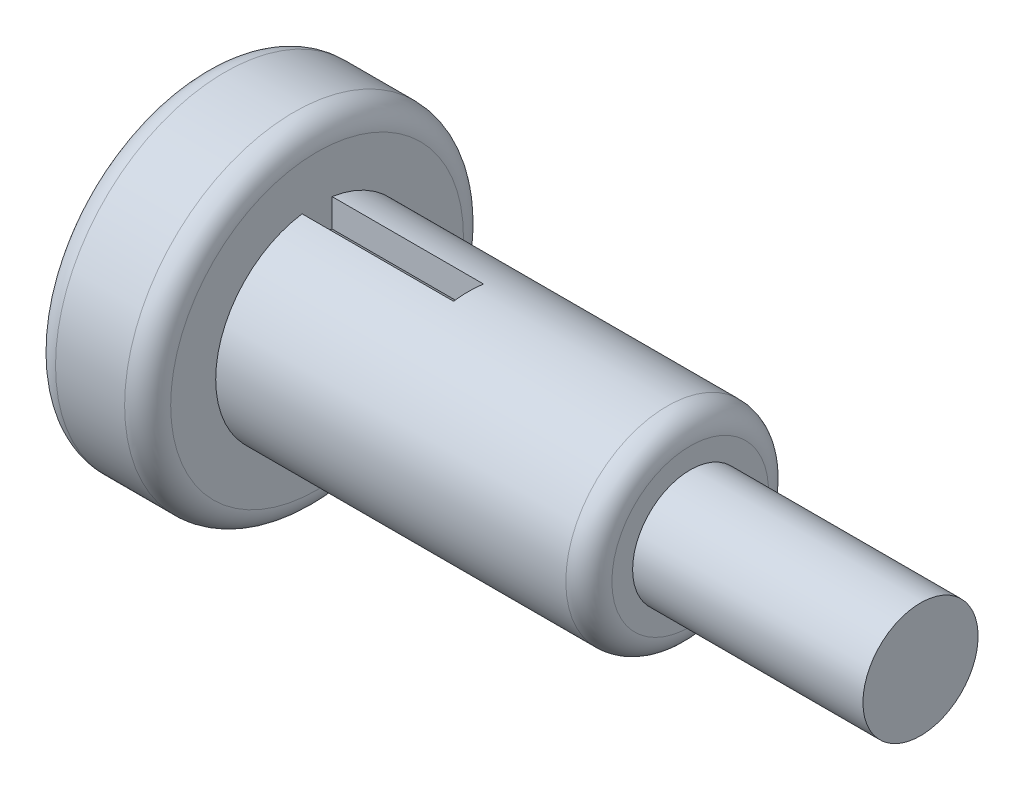
ISO-10303-21;
HEADER;
FILE_DESCRIPTION(('STEP AP214'),'2;1');
FILE_NAME('part.step','',(''),(''),'','','');
FILE_SCHEMA(('AUTOMOTIVE_DESIGN { 1 0 10303 214 1 1 1 1 }'));
ENDSEC;
DATA;
#1=APPLICATION_CONTEXT('core data for automotive mechanical design processes');
#2=APPLICATION_PROTOCOL_DEFINITION('international standard','automotive_design',2000,#1);
#3=PRODUCT_CONTEXT('',#1,'mechanical');
#4=PRODUCT('Part','Part','',(#3));
#5=PRODUCT_RELATED_PRODUCT_CATEGORY('part','',(#4));
#6=PRODUCT_DEFINITION_FORMATION('','',#4);
#7=PRODUCT_DEFINITION_CONTEXT('part definition',#1,'design');
#8=PRODUCT_DEFINITION('design','',#6,#7);
#9=PRODUCT_DEFINITION_SHAPE('','',#8);
#10=(LENGTH_UNIT() NAMED_UNIT(*) SI_UNIT(.MILLI.,.METRE.));
#11=(NAMED_UNIT(*) PLANE_ANGLE_UNIT() SI_UNIT($,.RADIAN.));
#12=(NAMED_UNIT(*) SI_UNIT($,.STERADIAN.) SOLID_ANGLE_UNIT());
#13=UNCERTAINTY_MEASURE_WITH_UNIT(LENGTH_MEASURE(1.E-05),#10,'distance_accuracy_value','');
#14=(GEOMETRIC_REPRESENTATION_CONTEXT(3) GLOBAL_UNCERTAINTY_ASSIGNED_CONTEXT((#13)) GLOBAL_UNIT_ASSIGNED_CONTEXT((#10,
#11,#12)) REPRESENTATION_CONTEXT('',''));
#15=CARTESIAN_POINT('',(0.,0.,0.));
#16=DIRECTION('',(0.,0.,1.));
#17=DIRECTION('',(1.,0.,0.));
#18=AXIS2_PLACEMENT_3D('',#15,#16,#17);
#19=CARTESIAN_POINT('',(-25.6768802228412,0.,0.));
#20=DIRECTION('',(-1.,0.,0.));
#21=DIRECTION('',(0.,0.,1.));
#22=AXIS2_PLACEMENT_3D('',#19,#20,#21);
#23=CYLINDRICAL_SURFACE('',#22,22.);
#24=CARTESIAN_POINT('',(-10.6768802228413,0.,0.));
#25=DIRECTION('',(-1.,0.,0.));
#26=DIRECTION('',(0.,0.,1.));
#27=AXIS2_PLACEMENT_3D('',#24,#25,#26);
#28=CIRCLE('',#27,22.);
#29=CARTESIAN_POINT('',(-10.6768802228413,0.,22.));
#30=VERTEX_POINT('',#29);
#31=EDGE_CURVE('E152',#30,#30,#28,.T.);
#32=ORIENTED_EDGE('',*,*,#31,.T.);
#33=EDGE_LOOP('',(#32));
#34=FACE_BOUND('',#33,.T.);
#35=DIRECTION('',(-1.,0.,0.));
#36=VECTOR('',#35,1.);
#37=CARTESIAN_POINT('',(-25.6768802228412,21.7586189819115,-3.25));
#38=LINE('',#37,#36);
#39=CARTESIAN_POINT('',(-53.8001498066124,21.7586189819115,-3.25));
#40=VERTEX_POINT('',#39);
#41=CARTESIAN_POINT('',(-86.6768802228412,21.7586189819115,-3.25));
#42=VERTEX_POINT('',#41);
#43=EDGE_CURVE('E182',#40,#42,#38,.T.);
#44=ORIENTED_EDGE('',*,*,#43,.F.);
#45=CARTESIAN_POINT('',(-55.4360263892614,0.,0.));
#46=DIRECTION('',(0.997185689275165,-0.074971335220956,0.));
#47=DIRECTION('',(-0.074971335220956,-0.997185689275166,0.));
#48=AXIS2_PLACEMENT_3D('',#45,#46,#47);
#49=ELLIPSE('',#48,22.062089575304,22.);
#50=CARTESIAN_POINT('',(-53.8001498066124,21.7586189819115,3.25));
#51=VERTEX_POINT('',#50);
#52=EDGE_CURVE('E178',#40,#51,#49,.T.);
#53=ORIENTED_EDGE('',*,*,#52,.T.);
#54=DIRECTION('',(-1.,0.,0.));
#55=VECTOR('',#54,1.);
#56=CARTESIAN_POINT('',(-25.6768802228412,21.7586189819115,3.25));
#57=LINE('',#56,#55);
#58=CARTESIAN_POINT('',(-86.6768802228412,21.7586189819115,3.25));
#59=VERTEX_POINT('',#58);
#60=EDGE_CURVE('E186',#51,#59,#57,.T.);
#61=ORIENTED_EDGE('',*,*,#60,.T.);
#62=CARTESIAN_POINT('',(-86.6768802228412,0.,0.));
#63=DIRECTION('',(-1.,0.,0.));
#64=DIRECTION('',(0.,0.,1.));
#65=AXIS2_PLACEMENT_3D('',#62,#63,#64);
#66=CIRCLE('',#65,22.);
#67=CARTESIAN_POINT('',(-86.6768802228412,-21.7586189819115,3.25));
#68=VERTEX_POINT('',#67);
#69=EDGE_CURVE('E123',#68,#59,#66,.T.);
#70=ORIENTED_EDGE('',*,*,#69,.F.);
#71=DIRECTION('',(-1.,0.,0.));
#72=VECTOR('',#71,1.);
#73=CARTESIAN_POINT('',(-25.6768802228412,-21.7586189819115,3.25));
#74=LINE('',#73,#72);
#75=CARTESIAN_POINT('',(-57.0719029719104,-21.7586189819115,3.25));
#76=VERTEX_POINT('',#75);
#77=EDGE_CURVE('E188',#68,#76,#74,.F.);
#78=ORIENTED_EDGE('',*,*,#77,.T.);
#79=CARTESIAN_POINT('',(-57.0719029719104,-21.7586189819115,-3.25));
#80=VERTEX_POINT('',#79);
#81=EDGE_CURVE('E179',#76,#80,#49,.T.);
#82=ORIENTED_EDGE('',*,*,#81,.T.);
#83=DIRECTION('',(-1.,0.,0.));
#84=VECTOR('',#83,1.);
#85=CARTESIAN_POINT('',(-25.6768802228412,-21.7586189819115,-3.25));
#86=LINE('',#85,#84);
#87=CARTESIAN_POINT('',(-86.6768802228412,-21.7586189819115,-3.25));
#88=VERTEX_POINT('',#87);
#89=EDGE_CURVE('E184',#88,#80,#86,.F.);
#90=ORIENTED_EDGE('',*,*,#89,.F.);
#91=EDGE_CURVE('E155',#42,#88,#66,.T.);
#92=ORIENTED_EDGE('',*,*,#91,.F.);
#93=EDGE_LOOP('',(#44,#53,#61,#70,#78,#82,#90,#92));
#94=FACE_BOUND('',#93,.T.);
#95=ADVANCED_FACE('F42',(#34,#94),#23,.T.);
#96=CARTESIAN_POINT('',(-25.6768802228412,0.,0.));
#97=DIRECTION('',(-1.,0.,0.));
#98=DIRECTION('',(0.,0.,1.));
#99=AXIS2_PLACEMENT_3D('',#96,#97,#98);
#100=CYLINDRICAL_SURFACE('',#99,16.);
#101=DIRECTION('',(-1.,0.,0.));
#102=VECTOR('',#101,1.);
#103=CARTESIAN_POINT('',(-25.6768802228412,-15.6664450338933,-3.25));
#104=LINE('',#103,#102);
#105=CARTESIAN_POINT('',(-56.6138755250732,-15.6664450338933,-3.25));
#106=VERTEX_POINT('',#105);
#107=CARTESIAN_POINT('',(-86.6768802228412,-15.6664450338933,-3.25));
#108=VERTEX_POINT('',#107);
#109=EDGE_CURVE('E113',#106,#108,#104,.T.);
#110=ORIENTED_EDGE('',*,*,#109,.F.);
#111=CARTESIAN_POINT('',(-55.4360263892614,0.,0.));
#112=DIRECTION('',(0.997185689275165,-0.074971335220956,0.));
#113=DIRECTION('',(-0.074971335220956,-0.997185689275166,0.));
#114=AXIS2_PLACEMENT_3D('',#111,#112,#113);
#115=ELLIPSE('',#114,16.0451560547666,16.);
#116=CARTESIAN_POINT('',(-56.6138755250732,-15.6664450338933,3.25));
#117=VERTEX_POINT('',#116);
#118=EDGE_CURVE('E132',#106,#117,#115,.F.);
#119=ORIENTED_EDGE('',*,*,#118,.T.);
#120=DIRECTION('',(-1.,0.,0.));
#121=VECTOR('',#120,1.);
#122=CARTESIAN_POINT('',(-25.6768802228412,-15.6664450338933,3.25));
#123=LINE('',#122,#121);
#124=CARTESIAN_POINT('',(-86.6768802228412,-15.6664450338933,3.25));
#125=VERTEX_POINT('',#124);
#126=EDGE_CURVE('E140',#117,#125,#123,.T.);
#127=ORIENTED_EDGE('',*,*,#126,.T.);
#128=CARTESIAN_POINT('',(-86.6768802228412,0.,0.));
#129=DIRECTION('',(-1.,0.,0.));
#130=DIRECTION('',(0.,0.,1.));
#131=AXIS2_PLACEMENT_3D('',#128,#129,#130);
#132=CIRCLE('',#131,16.);
#133=EDGE_CURVE('E130',#125,#108,#132,.F.);
#134=ORIENTED_EDGE('',*,*,#133,.T.);
#135=EDGE_LOOP('',(#110,#119,#127,#134));
#136=FACE_BOUND('',#135,.T.);
#137=CARTESIAN_POINT('',(-25.6768802228412,0.,0.));
#138=DIRECTION('',(-1.,0.,0.));
#139=DIRECTION('',(0.,0.,1.));
#140=AXIS2_PLACEMENT_3D('',#137,#138,#139);
#141=CIRCLE('',#140,16.);
#142=CARTESIAN_POINT('',(-25.6768802228412,0.,16.));
#143=VERTEX_POINT('',#142);
#144=EDGE_CURVE('E175',#143,#143,#141,.T.);
#145=ORIENTED_EDGE('',*,*,#144,.F.);
#146=EDGE_LOOP('',(#145));
#147=FACE_BOUND('',#146,.T.);
#148=CARTESIAN_POINT('',(-106.676880222841,0.,0.));
#149=DIRECTION('',(-1.,0.,0.));
#150=DIRECTION('',(0.,0.,1.));
#151=AXIS2_PLACEMENT_3D('',#148,#149,#150);
#152=CIRCLE('',#151,16.);
#153=CARTESIAN_POINT('',(-106.676880222841,0.,16.));
#154=VERTEX_POINT('',#153);
#155=EDGE_CURVE('E172',#154,#154,#152,.T.);
#156=ORIENTED_EDGE('',*,*,#155,.T.);
#157=EDGE_LOOP('',(#156));
#158=FACE_BOUND('',#157,.T.);
#159=DIRECTION('',(-1.,0.,0.));
#160=VECTOR('',#159,1.);
#161=CARTESIAN_POINT('',(-25.6768802228412,15.6664450338933,-3.25));
#162=LINE('',#161,#160);
#163=CARTESIAN_POINT('',(-86.6768802228412,15.6664450338933,-3.25));
#164=VERTEX_POINT('',#163);
#165=CARTESIAN_POINT('',(-54.2581772534496,15.6664450338933,-3.25));
#166=VERTEX_POINT('',#165);
#167=EDGE_CURVE('E11',#164,#166,#162,.F.);
#168=ORIENTED_EDGE('',*,*,#167,.F.);
#169=CARTESIAN_POINT('',(-86.6768802228412,15.6664450338933,3.25));
#170=VERTEX_POINT('',#169);
#171=EDGE_CURVE('E50',#164,#170,#132,.F.);
#172=ORIENTED_EDGE('',*,*,#171,.T.);
#173=DIRECTION('',(-1.,0.,0.));
#174=VECTOR('',#173,1.);
#175=CARTESIAN_POINT('',(-25.6768802228412,15.6664450338933,3.25));
#176=LINE('',#175,#174);
#177=CARTESIAN_POINT('',(-54.2581772534496,15.6664450338933,3.25));
#178=VERTEX_POINT('',#177);
#179=EDGE_CURVE('E104',#170,#178,#176,.F.);
#180=ORIENTED_EDGE('',*,*,#179,.T.);
#181=EDGE_CURVE('E112',#178,#166,#115,.F.);
#182=ORIENTED_EDGE('',*,*,#181,.T.);
#183=EDGE_LOOP('',(#168,#172,#180,#182));
#184=FACE_BOUND('',#183,.T.);
#185=ADVANCED_FACE('F128',(#136,#147,#158,#184),#100,.F.);
#186=CARTESIAN_POINT('',(44.3231197771588,0.,0.));
#187=DIRECTION('',(-1.,0.,0.));
#188=DIRECTION('',(0.,0.,1.));
#189=AXIS2_PLACEMENT_3D('',#186,#187,#188);
#190=PLANE('',#189);
#191=CARTESIAN_POINT('',(44.3231197771588,0.,0.));
#192=DIRECTION('',(-1.,0.,0.));
#193=DIRECTION('',(0.,0.,1.));
#194=AXIS2_PLACEMENT_3D('',#191,#192,#193);
#195=CIRCLE('',#194,12.5);
#196=CARTESIAN_POINT('',(44.3231197771588,0.,12.5));
#197=VERTEX_POINT('',#196);
#198=EDGE_CURVE('E141',#197,#197,#195,.T.);
#199=ORIENTED_EDGE('',*,*,#198,.F.);
#200=EDGE_LOOP('',(#199));
#201=FACE_BOUND('',#200,.T.);
#202=ADVANCED_FACE('F44',(#201),#190,.F.);
#203=CARTESIAN_POINT('',(-25.6768802228412,0.,0.));
#204=DIRECTION('',(-1.,0.,0.));
#205=DIRECTION('',(0.,0.,1.));
#206=AXIS2_PLACEMENT_3D('',#203,#204,#205);
#207=CYLINDRICAL_SURFACE('',#206,12.5);
#208=CARTESIAN_POINT('',(-5.67688022284123,0.,0.));
#209=DIRECTION('',(-1.,0.,0.));
#210=DIRECTION('',(0.,0.,1.));
#211=AXIS2_PLACEMENT_3D('',#208,#209,#210);
#212=CIRCLE('',#211,12.5);
#213=CARTESIAN_POINT('',(-5.67688022284123,0.,12.5));
#214=VERTEX_POINT('',#213);
#215=EDGE_CURVE('E146',#214,#214,#212,.T.);
#216=ORIENTED_EDGE('',*,*,#215,.F.);
#217=EDGE_LOOP('',(#216));
#218=FACE_BOUND('',#217,.T.);
#219=ORIENTED_EDGE('',*,*,#198,.T.);
#220=EDGE_LOOP('',(#219));
#221=FACE_BOUND('',#220,.T.);
#222=ADVANCED_FACE('F266',(#218,#221),#207,.T.);
#223=CARTESIAN_POINT('',(-5.67688022284123,0.,-12.5));
#224=DIRECTION('',(-1.,0.,0.));
#225=DIRECTION('',(0.,0.,1.));
#226=AXIS2_PLACEMENT_3D('',#223,#224,#225);
#227=PLANE('',#226);
#228=CARTESIAN_POINT('',(-5.67688022284122,0.,0.));
#229=DIRECTION('',(-1.,0.,0.));
#230=DIRECTION('',(0.,0.,1.));
#231=AXIS2_PLACEMENT_3D('',#228,#229,#230);
#232=CIRCLE('',#231,17.);
#233=CARTESIAN_POINT('',(-5.67688022284122,0.,17.));
#234=VERTEX_POINT('',#233);
#235=EDGE_CURVE('E149',#234,#234,#232,.T.);
#236=ORIENTED_EDGE('',*,*,#235,.F.);
#237=EDGE_LOOP('',(#236));
#238=FACE_BOUND('',#237,.T.);
#239=ORIENTED_EDGE('',*,*,#215,.T.);
#240=EDGE_LOOP('',(#239));
#241=FACE_BOUND('',#240,.T.);
#242=ADVANCED_FACE('F256',(#238,#241),#227,.F.);
#243=CARTESIAN_POINT('',(-10.6768802228412,0.,0.));
#244=DIRECTION('',(-1.,0.,0.));
#245=DIRECTION('',(0.,0.,1.));
#246=AXIS2_PLACEMENT_3D('',#243,#244,#245);
#247=TOROIDAL_SURFACE('',#246,17.,5.);
#248=ORIENTED_EDGE('',*,*,#31,.F.);
#249=EDGE_LOOP('',(#248));
#250=FACE_BOUND('',#249,.T.);
#251=ORIENTED_EDGE('',*,*,#235,.T.);
#252=EDGE_LOOP('',(#251));
#253=FACE_BOUND('',#252,.T.);
#254=ADVANCED_FACE('F251',(#250,#253),#247,.T.);
#255=CARTESIAN_POINT('',(-86.6768802228412,0.,-22.));
#256=DIRECTION('',(-1.,0.,0.));
#257=DIRECTION('',(0.,0.,1.));
#258=AXIS2_PLACEMENT_3D('',#255,#256,#257);
#259=PLANE('',#258);
#260=ORIENTED_EDGE('',*,*,#91,.T.);
#261=DIRECTION('',(0.,-1.,0.));
#262=VECTOR('',#261,1.);
#263=CARTESIAN_POINT('',(-86.6768802228412,0.,-3.25));
#264=LINE('',#263,#262);
#265=EDGE_CURVE('E124',#108,#88,#264,.T.);
#266=ORIENTED_EDGE('',*,*,#265,.F.);
#267=ORIENTED_EDGE('',*,*,#133,.F.);
#268=DIRECTION('',(0.,-1.,0.));
#269=VECTOR('',#268,1.);
#270=CARTESIAN_POINT('',(-86.6768802228412,0.,3.25));
#271=LINE('',#270,#269);
#272=EDGE_CURVE('E125',#125,#68,#271,.T.);
#273=ORIENTED_EDGE('',*,*,#272,.T.);
#274=ORIENTED_EDGE('',*,*,#69,.T.);
#275=EDGE_CURVE('E65',#59,#170,#271,.T.);
#276=ORIENTED_EDGE('',*,*,#275,.T.);
#277=ORIENTED_EDGE('',*,*,#171,.F.);
#278=EDGE_CURVE('E196',#42,#164,#264,.T.);
#279=ORIENTED_EDGE('',*,*,#278,.F.);
#280=EDGE_LOOP('',(#260,#266,#267,#273,#274,#276,#277,#279));
#281=FACE_BOUND('',#280,.T.);
#282=CARTESIAN_POINT('',(-86.6768802228412,0.,0.));
#283=DIRECTION('',(-1.,0.,0.));
#284=DIRECTION('',(0.,0.,1.));
#285=AXIS2_PLACEMENT_3D('',#282,#283,#284);
#286=CIRCLE('',#285,31.7743732590528);
#287=CARTESIAN_POINT('',(-86.6768802228412,0.,31.7743732590528));
#288=VERTEX_POINT('',#287);
#289=EDGE_CURVE('E157',#288,#288,#286,.T.);
#290=ORIENTED_EDGE('',*,*,#289,.F.);
#291=EDGE_LOOP('',(#290));
#292=FACE_BOUND('',#291,.T.);
#293=ADVANCED_FACE('F117',(#281,#292),#259,.F.);
#294=CARTESIAN_POINT('',(-91.6768802228412,0.,0.));
#295=DIRECTION('',(-1.,0.,0.));
#296=DIRECTION('',(0.,0.,1.));
#297=AXIS2_PLACEMENT_3D('',#294,#295,#296);
#298=TOROIDAL_SURFACE('',#297,31.7743732590528,5.);
#299=CARTESIAN_POINT('',(-91.6768802228413,0.,0.));
#300=DIRECTION('',(-1.,0.,0.));
#301=DIRECTION('',(0.,0.,1.));
#302=AXIS2_PLACEMENT_3D('',#299,#300,#301);
#303=CIRCLE('',#302,36.7743732590529);
#304=CARTESIAN_POINT('',(-91.6768802228413,0.,36.7743732590529));
#305=VERTEX_POINT('',#304);
#306=EDGE_CURVE('E160',#305,#305,#303,.T.);
#307=ORIENTED_EDGE('',*,*,#306,.F.);
#308=EDGE_LOOP('',(#307));
#309=FACE_BOUND('',#308,.T.);
#310=ORIENTED_EDGE('',*,*,#289,.T.);
#311=EDGE_LOOP('',(#310));
#312=FACE_BOUND('',#311,.T.);
#313=ADVANCED_FACE('F242',(#309,#312),#298,.T.);
#314=CARTESIAN_POINT('',(-25.6768802228412,0.,0.));
#315=DIRECTION('',(-1.,0.,0.));
#316=DIRECTION('',(0.,0.,1.));
#317=AXIS2_PLACEMENT_3D('',#314,#315,#316);
#318=CYLINDRICAL_SURFACE('',#317,36.7743732590529);
#319=CARTESIAN_POINT('',(-106.676880222841,0.,0.));
#320=DIRECTION('',(-1.,0.,0.));
#321=DIRECTION('',(0.,0.,1.));
#322=AXIS2_PLACEMENT_3D('',#319,#320,#321);
#323=CIRCLE('',#322,36.7743732590528);
#324=CARTESIAN_POINT('',(-106.676880222841,0.,36.7743732590528));
#325=VERTEX_POINT('',#324);
#326=EDGE_CURVE('E163',#325,#325,#323,.T.);
#327=ORIENTED_EDGE('',*,*,#326,.F.);
#328=EDGE_LOOP('',(#327));
#329=FACE_BOUND('',#328,.T.);
#330=ORIENTED_EDGE('',*,*,#306,.T.);
#331=EDGE_LOOP('',(#330));
#332=FACE_BOUND('',#331,.T.);
#333=ADVANCED_FACE('F236',(#329,#332),#318,.T.);
#334=CARTESIAN_POINT('',(-106.676880222841,0.,0.));
#335=DIRECTION('',(-1.,0.,0.));
#336=DIRECTION('',(0.,0.,1.));
#337=AXIS2_PLACEMENT_3D('',#334,#335,#336);
#338=TOROIDAL_SURFACE('',#337,31.7743732590528,5.);
#339=CARTESIAN_POINT('',(-111.676880222841,0.,0.));
#340=DIRECTION('',(-1.,0.,0.));
#341=DIRECTION('',(0.,0.,1.));
#342=AXIS2_PLACEMENT_3D('',#339,#340,#341);
#343=CIRCLE('',#342,31.7743732590528);
#344=CARTESIAN_POINT('',(-111.676880222841,0.,31.7743732590528));
#345=VERTEX_POINT('',#344);
#346=EDGE_CURVE('E166',#345,#345,#343,.T.);
#347=ORIENTED_EDGE('',*,*,#346,.F.);
#348=EDGE_LOOP('',(#347));
#349=FACE_BOUND('',#348,.T.);
#350=ORIENTED_EDGE('',*,*,#326,.T.);
#351=EDGE_LOOP('',(#350));
#352=FACE_BOUND('',#351,.T.);
#353=ADVANCED_FACE('F230',(#349,#352),#338,.T.);
#354=CARTESIAN_POINT('',(-111.676880222841,0.,-31.7743732590528));
#355=DIRECTION('',(1.,0.,0.));
#356=DIRECTION('',(0.,0.,-1.));
#357=AXIS2_PLACEMENT_3D('',#354,#355,#356);
#358=PLANE('',#357);
#359=CARTESIAN_POINT('',(-111.676880222841,0.,0.));
#360=DIRECTION('',(-1.,0.,0.));
#361=DIRECTION('',(0.,0.,1.));
#362=AXIS2_PLACEMENT_3D('',#359,#360,#361);
#363=CIRCLE('',#362,21.);
#364=CARTESIAN_POINT('',(-111.676880222841,0.,21.));
#365=VERTEX_POINT('',#364);
#366=EDGE_CURVE('E169',#365,#365,#363,.T.);
#367=ORIENTED_EDGE('',*,*,#366,.F.);
#368=EDGE_LOOP('',(#367));
#369=FACE_BOUND('',#368,.T.);
#370=ORIENTED_EDGE('',*,*,#346,.T.);
#371=EDGE_LOOP('',(#370));
#372=FACE_BOUND('',#371,.T.);
#373=ADVANCED_FACE('F224',(#369,#372),#358,.F.);
#374=CARTESIAN_POINT('',(-106.676880222841,0.,0.));
#375=DIRECTION('',(-1.,0.,0.));
#376=DIRECTION('',(0.,0.,1.));
#377=AXIS2_PLACEMENT_3D('',#374,#375,#376);
#378=TOROIDAL_SURFACE('',#377,21.,5.);
#379=ORIENTED_EDGE('',*,*,#155,.F.);
#380=EDGE_LOOP('',(#379));
#381=FACE_BOUND('',#380,.T.);
#382=ORIENTED_EDGE('',*,*,#366,.T.);
#383=EDGE_LOOP('',(#382));
#384=FACE_BOUND('',#383,.T.);
#385=ADVANCED_FACE('F220',(#381,#384),#378,.T.);
#386=CARTESIAN_POINT('',(-25.6768802228412,0.,-16.));
#387=DIRECTION('',(1.,0.,0.));
#388=DIRECTION('',(0.,0.,-1.));
#389=AXIS2_PLACEMENT_3D('',#386,#387,#388);
#390=PLANE('',#389);
#391=ORIENTED_EDGE('',*,*,#144,.T.);
#392=EDGE_LOOP('',(#391));
#393=FACE_BOUND('',#392,.T.);
#394=ADVANCED_FACE('F223',(#393),#390,.F.);
#395=CARTESIAN_POINT('',(0.,0.,-3.25));
#396=DIRECTION('',(0.,0.,1.));
#397=DIRECTION('',(1.,0.,0.));
#398=AXIS2_PLACEMENT_3D('',#395,#396,#397);
#399=PLANE('',#398);
#400=ORIENTED_EDGE('',*,*,#89,.T.);
#401=DIRECTION('',(0.074971335220956,0.997185689275166,0.));
#402=VECTOR('',#401,1.);
#403=CARTESIAN_POINT('',(-59.6768802228412,-56.4071420188801,-3.25));
#404=LINE('',#403,#402);
#405=EDGE_CURVE('E190',#80,#106,#404,.T.);
#406=ORIENTED_EDGE('',*,*,#405,.T.);
#407=ORIENTED_EDGE('',*,*,#109,.T.);
#408=ORIENTED_EDGE('',*,*,#265,.T.);
#409=EDGE_LOOP('',(#400,#406,#407,#408));
#410=FACE_BOUND('',#409,.T.);
#411=ADVANCED_FACE('F209',(#410),#399,.T.);
#412=CARTESIAN_POINT('',(0.,0.,3.25));
#413=DIRECTION('',(0.,0.,1.));
#414=DIRECTION('',(1.,0.,0.));
#415=AXIS2_PLACEMENT_3D('',#412,#413,#414);
#416=PLANE('',#415);
#417=ORIENTED_EDGE('',*,*,#272,.F.);
#418=ORIENTED_EDGE('',*,*,#126,.F.);
#419=DIRECTION('',(0.074971335220956,0.997185689275166,0.));
#420=VECTOR('',#419,1.);
#421=CARTESIAN_POINT('',(-59.6768802228412,-56.4071420188801,3.25));
#422=LINE('',#421,#420);
#423=EDGE_CURVE('E57',#76,#117,#422,.T.);
#424=ORIENTED_EDGE('',*,*,#423,.F.);
#425=ORIENTED_EDGE('',*,*,#77,.F.);
#426=EDGE_LOOP('',(#417,#418,#424,#425));
#427=FACE_BOUND('',#426,.T.);
#428=ADVANCED_FACE('F212',(#427),#416,.F.);
#429=CARTESIAN_POINT('',(-59.6768802228412,-56.4071420188801,-3.25));
#430=DIRECTION('',(0.997185689275165,-0.074971335220956,0.));
#431=DIRECTION('',(0.074971335220956,0.997185689275166,0.));
#432=AXIS2_PLACEMENT_3D('',#429,#430,#431);
#433=PLANE('',#432);
#434=ORIENTED_EDGE('',*,*,#423,.T.);
#435=ORIENTED_EDGE('',*,*,#118,.F.);
#436=ORIENTED_EDGE('',*,*,#405,.F.);
#437=ORIENTED_EDGE('',*,*,#81,.F.);
#438=EDGE_LOOP('',(#434,#435,#436,#437));
#439=FACE_BOUND('',#438,.T.);
#440=ADVANCED_FACE('F211',(#439),#433,.F.);
#441=EDGE_CURVE('E193',#166,#40,#404,.T.);
#442=ORIENTED_EDGE('',*,*,#441,.F.);
#443=ORIENTED_EDGE('',*,*,#181,.F.);
#444=EDGE_CURVE('E107',#178,#51,#422,.T.);
#445=ORIENTED_EDGE('',*,*,#444,.T.);
#446=ORIENTED_EDGE('',*,*,#52,.F.);
#447=EDGE_LOOP('',(#442,#443,#445,#446));
#448=FACE_BOUND('',#447,.T.);
#449=ADVANCED_FACE('F306',(#448),#433,.F.);
#450=ORIENTED_EDGE('',*,*,#43,.T.);
#451=ORIENTED_EDGE('',*,*,#278,.T.);
#452=ORIENTED_EDGE('',*,*,#167,.T.);
#453=ORIENTED_EDGE('',*,*,#441,.T.);
#454=EDGE_LOOP('',(#450,#451,#452,#453));
#455=FACE_BOUND('',#454,.T.);
#456=ADVANCED_FACE('F201',(#455),#399,.T.);
#457=ORIENTED_EDGE('',*,*,#444,.F.);
#458=ORIENTED_EDGE('',*,*,#179,.F.);
#459=ORIENTED_EDGE('',*,*,#275,.F.);
#460=ORIENTED_EDGE('',*,*,#60,.F.);
#461=EDGE_LOOP('',(#457,#458,#459,#460));
#462=FACE_BOUND('',#461,.T.);
#463=ADVANCED_FACE('F105',(#462),#416,.F.);
#464=CLOSED_SHELL('',(#95,#185,#202,#222,#242,#254,#293,#313,#333,#353,#373,#385,#394,#411,#428,
#440,#449,#456,#463));
#465=MANIFOLD_SOLID_BREP('B2',#464);
#466=ADVANCED_BREP_SHAPE_REPRESENTATION('',(#18,#465),#14);
#467=SHAPE_DEFINITION_REPRESENTATION(#9,#466);
ENDSEC;
END-ISO-10303-21;
